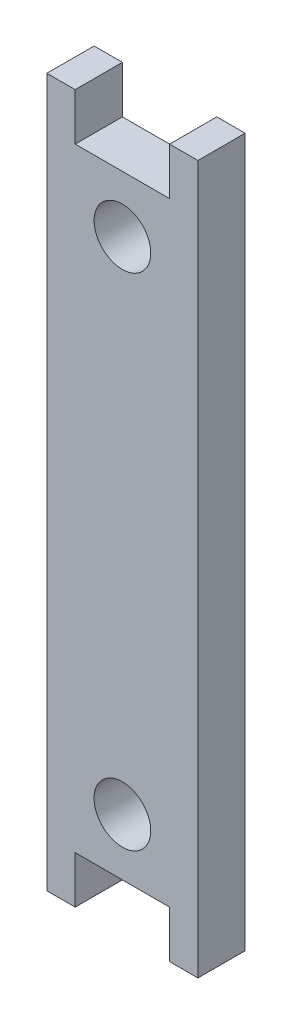
ISO-10303-21;
HEADER;
FILE_DESCRIPTION(('STEP AP214'),'2;1');
FILE_NAME('part.step','',(''),(''),'','','');
FILE_SCHEMA(('AUTOMOTIVE_DESIGN { 1 0 10303 214 1 1 1 1 }'));
ENDSEC;
DATA;
#1=APPLICATION_CONTEXT('core data for automotive mechanical design processes');
#2=APPLICATION_PROTOCOL_DEFINITION('international standard','automotive_design',2000,#1);
#3=PRODUCT_CONTEXT('',#1,'mechanical');
#4=PRODUCT('Part','Part','',(#3));
#5=PRODUCT_RELATED_PRODUCT_CATEGORY('part','',(#4));
#6=PRODUCT_DEFINITION_FORMATION('','',#4);
#7=PRODUCT_DEFINITION_CONTEXT('part definition',#1,'design');
#8=PRODUCT_DEFINITION('design','',#6,#7);
#9=PRODUCT_DEFINITION_SHAPE('','',#8);
#10=(LENGTH_UNIT() NAMED_UNIT(*) SI_UNIT(.MILLI.,.METRE.));
#11=(NAMED_UNIT(*) PLANE_ANGLE_UNIT() SI_UNIT($,.RADIAN.));
#12=(NAMED_UNIT(*) SI_UNIT($,.STERADIAN.) SOLID_ANGLE_UNIT());
#13=UNCERTAINTY_MEASURE_WITH_UNIT(LENGTH_MEASURE(1.E-05),#10,'distance_accuracy_value','');
#14=(GEOMETRIC_REPRESENTATION_CONTEXT(3) GLOBAL_UNCERTAINTY_ASSIGNED_CONTEXT((#13)) GLOBAL_UNIT_ASSIGNED_CONTEXT((#10,
#11,#12)) REPRESENTATION_CONTEXT('',''));
#15=CARTESIAN_POINT('',(0.,0.,0.));
#16=DIRECTION('',(0.,0.,1.));
#17=DIRECTION('',(1.,0.,0.));
#18=AXIS2_PLACEMENT_3D('',#15,#16,#17);
#19=CARTESIAN_POINT('',(0.,0.,5.));
#20=DIRECTION('',(0.,0.,1.));
#21=DIRECTION('',(1.,0.,0.));
#22=AXIS2_PLACEMENT_3D('',#19,#20,#21);
#23=PLANE('',#22);
#24=CARTESIAN_POINT('',(0.,26.5,5.));
#25=DIRECTION('',(0.,0.,1.));
#26=DIRECTION('',(1.,0.,0.));
#27=AXIS2_PLACEMENT_3D('',#24,#25,#26);
#28=CIRCLE('',#27,3.);
#29=CARTESIAN_POINT('',(3.,26.5,5.));
#30=VERTEX_POINT('',#29);
#31=EDGE_CURVE('E164',#30,#30,#28,.T.);
#32=ORIENTED_EDGE('',*,*,#31,.F.);
#33=EDGE_LOOP('',(#32));
#34=FACE_BOUND('',#33,.T.);
#35=DIRECTION('',(0.,1.,0.));
#36=VECTOR('',#35,1.);
#37=CARTESIAN_POINT('',(-5.,37.5000000000001,5.));
#38=LINE('',#37,#36);
#39=CARTESIAN_POINT('',(-5.,32.5000000000001,5.));
#40=VERTEX_POINT('',#39);
#41=CARTESIAN_POINT('',(-5.,37.5000000000001,5.));
#42=VERTEX_POINT('',#41);
#43=EDGE_CURVE('E183',#40,#42,#38,.T.);
#44=ORIENTED_EDGE('',*,*,#43,.T.);
#45=DIRECTION('',(-1.,0.,0.));
#46=VECTOR('',#45,1.);
#47=CARTESIAN_POINT('',(-5.,37.5000000000001,5.));
#48=LINE('',#47,#46);
#49=CARTESIAN_POINT('',(-7.99999999999998,37.5,5.));
#50=VERTEX_POINT('',#49);
#51=EDGE_CURVE('E111',#42,#50,#48,.T.);
#52=ORIENTED_EDGE('',*,*,#51,.T.);
#53=DIRECTION('',(0.,-1.,0.));
#54=VECTOR('',#53,1.);
#55=CARTESIAN_POINT('',(-7.99999999999998,37.5,5.));
#56=LINE('',#55,#54);
#57=CARTESIAN_POINT('',(-7.99999999999998,-37.5,5.));
#58=VERTEX_POINT('',#57);
#59=EDGE_CURVE('E210',#50,#58,#56,.T.);
#60=ORIENTED_EDGE('',*,*,#59,.T.);
#61=DIRECTION('',(1.,0.,0.));
#62=VECTOR('',#61,1.);
#63=CARTESIAN_POINT('',(-7.99999999999998,-37.5,5.));
#64=LINE('',#63,#62);
#65=CARTESIAN_POINT('',(-5.,-37.5000000000001,5.));
#66=VERTEX_POINT('',#65);
#67=EDGE_CURVE('E229',#58,#66,#64,.T.);
#68=ORIENTED_EDGE('',*,*,#67,.T.);
#69=DIRECTION('',(0.,1.,0.));
#70=VECTOR('',#69,1.);
#71=CARTESIAN_POINT('',(-5.,-37.5000000000001,5.));
#72=LINE('',#71,#70);
#73=CARTESIAN_POINT('',(-5.,-32.5000000000001,5.));
#74=VERTEX_POINT('',#73);
#75=EDGE_CURVE('E226',#66,#74,#72,.T.);
#76=ORIENTED_EDGE('',*,*,#75,.T.);
#77=DIRECTION('',(1.,0.,0.));
#78=VECTOR('',#77,1.);
#79=CARTESIAN_POINT('',(-5.,-32.5000000000001,5.));
#80=LINE('',#79,#78);
#81=CARTESIAN_POINT('',(5.,-32.5000000000001,5.));
#82=VERTEX_POINT('',#81);
#83=EDGE_CURVE('E228',#74,#82,#80,.T.);
#84=ORIENTED_EDGE('',*,*,#83,.T.);
#85=DIRECTION('',(0.,-1.,0.));
#86=VECTOR('',#85,1.);
#87=CARTESIAN_POINT('',(5.,-32.5000000000001,5.));
#88=LINE('',#87,#86);
#89=CARTESIAN_POINT('',(5.,-37.5000000000001,5.));
#90=VERTEX_POINT('',#89);
#91=EDGE_CURVE('E231',#82,#90,#88,.T.);
#92=ORIENTED_EDGE('',*,*,#91,.T.);
#93=DIRECTION('',(1.,0.,0.));
#94=VECTOR('',#93,1.);
#95=CARTESIAN_POINT('',(5.,-37.5000000000001,5.));
#96=LINE('',#95,#94);
#97=CARTESIAN_POINT('',(8.,-37.5,5.));
#98=VERTEX_POINT('',#97);
#99=EDGE_CURVE('E237',#90,#98,#96,.T.);
#100=ORIENTED_EDGE('',*,*,#99,.T.);
#101=DIRECTION('',(0.,1.,0.));
#102=VECTOR('',#101,1.);
#103=CARTESIAN_POINT('',(8.,-37.5,5.));
#104=LINE('',#103,#102);
#105=CARTESIAN_POINT('',(8.00000000000002,37.5,5.));
#106=VERTEX_POINT('',#105);
#107=EDGE_CURVE('E142',#98,#106,#104,.T.);
#108=ORIENTED_EDGE('',*,*,#107,.T.);
#109=DIRECTION('',(-1.,0.,0.));
#110=VECTOR('',#109,1.);
#111=CARTESIAN_POINT('',(8.00000000000002,37.5,5.));
#112=LINE('',#111,#110);
#113=CARTESIAN_POINT('',(5.,37.5000000000001,5.));
#114=VERTEX_POINT('',#113);
#115=EDGE_CURVE('E136',#106,#114,#112,.T.);
#116=ORIENTED_EDGE('',*,*,#115,.T.);
#117=DIRECTION('',(0.,-1.,0.));
#118=VECTOR('',#117,1.);
#119=CARTESIAN_POINT('',(5.,32.5000000000001,5.));
#120=LINE('',#119,#118);
#121=CARTESIAN_POINT('',(5.,32.5000000000001,5.));
#122=VERTEX_POINT('',#121);
#123=EDGE_CURVE('E140',#114,#122,#120,.T.);
#124=ORIENTED_EDGE('',*,*,#123,.T.);
#125=DIRECTION('',(-1.,0.,0.));
#126=VECTOR('',#125,1.);
#127=CARTESIAN_POINT('',(-5.,32.5000000000001,5.));
#128=LINE('',#127,#126);
#129=EDGE_CURVE('E56',#122,#40,#128,.T.);
#130=ORIENTED_EDGE('',*,*,#129,.T.);
#131=EDGE_LOOP('',(#44,#52,#60,#68,#76,#84,#92,#100,#108,#116,#124,#130));
#132=FACE_BOUND('',#131,.T.);
#133=CARTESIAN_POINT('',(0.,-26.5,5.));
#134=DIRECTION('',(0.,0.,1.));
#135=DIRECTION('',(-1.,0.,0.));
#136=AXIS2_PLACEMENT_3D('',#133,#134,#135);
#137=CIRCLE('',#136,3.);
#138=CARTESIAN_POINT('',(-3.,-26.5,5.));
#139=VERTEX_POINT('',#138);
#140=EDGE_CURVE('E279',#139,#139,#137,.T.);
#141=ORIENTED_EDGE('',*,*,#140,.F.);
#142=EDGE_LOOP('',(#141));
#143=FACE_BOUND('',#142,.T.);
#144=ADVANCED_FACE('F39',(#34,#132,#143),#23,.T.);
#145=CARTESIAN_POINT('',(0.,0.,0.));
#146=DIRECTION('',(0.,0.,1.));
#147=DIRECTION('',(1.,0.,0.));
#148=AXIS2_PLACEMENT_3D('',#145,#146,#147);
#149=PLANE('',#148);
#150=DIRECTION('',(0.,1.,0.));
#151=VECTOR('',#150,1.);
#152=CARTESIAN_POINT('',(-5.,37.5000000000001,0.));
#153=LINE('',#152,#151);
#154=CARTESIAN_POINT('',(-5.,32.5000000000001,0.));
#155=VERTEX_POINT('',#154);
#156=CARTESIAN_POINT('',(-5.,37.5000000000001,0.));
#157=VERTEX_POINT('',#156);
#158=EDGE_CURVE('E160',#155,#157,#153,.T.);
#159=ORIENTED_EDGE('',*,*,#158,.F.);
#160=DIRECTION('',(-1.,0.,0.));
#161=VECTOR('',#160,1.);
#162=CARTESIAN_POINT('',(-5.,32.5000000000001,0.));
#163=LINE('',#162,#161);
#164=CARTESIAN_POINT('',(5.,32.5000000000001,0.));
#165=VERTEX_POINT('',#164);
#166=EDGE_CURVE('E103',#165,#155,#163,.T.);
#167=ORIENTED_EDGE('',*,*,#166,.F.);
#168=DIRECTION('',(0.,-1.,0.));
#169=VECTOR('',#168,1.);
#170=CARTESIAN_POINT('',(5.,32.5000000000001,0.));
#171=LINE('',#170,#169);
#172=CARTESIAN_POINT('',(5.,37.5000000000001,0.));
#173=VERTEX_POINT('',#172);
#174=EDGE_CURVE('E97',#173,#165,#171,.T.);
#175=ORIENTED_EDGE('',*,*,#174,.F.);
#176=DIRECTION('',(-1.,0.,0.));
#177=VECTOR('',#176,1.);
#178=CARTESIAN_POINT('',(8.00000000000002,37.5,0.));
#179=LINE('',#178,#177);
#180=CARTESIAN_POINT('',(8.00000000000002,37.5,0.));
#181=VERTEX_POINT('',#180);
#182=EDGE_CURVE('E150',#181,#173,#179,.T.);
#183=ORIENTED_EDGE('',*,*,#182,.F.);
#184=DIRECTION('',(0.,1.,0.));
#185=VECTOR('',#184,1.);
#186=CARTESIAN_POINT('',(8.,-37.5,0.));
#187=LINE('',#186,#185);
#188=CARTESIAN_POINT('',(8.,-37.5,0.));
#189=VERTEX_POINT('',#188);
#190=EDGE_CURVE('E178',#189,#181,#187,.T.);
#191=ORIENTED_EDGE('',*,*,#190,.F.);
#192=DIRECTION('',(1.,0.,0.));
#193=VECTOR('',#192,1.);
#194=CARTESIAN_POINT('',(5.,-37.5000000000001,0.));
#195=LINE('',#194,#193);
#196=CARTESIAN_POINT('',(5.,-37.5000000000001,0.));
#197=VERTEX_POINT('',#196);
#198=EDGE_CURVE('E176',#197,#189,#195,.T.);
#199=ORIENTED_EDGE('',*,*,#198,.F.);
#200=DIRECTION('',(0.,-1.,0.));
#201=VECTOR('',#200,1.);
#202=CARTESIAN_POINT('',(5.,-32.5000000000001,0.));
#203=LINE('',#202,#201);
#204=CARTESIAN_POINT('',(5.,-32.5000000000001,0.));
#205=VERTEX_POINT('',#204);
#206=EDGE_CURVE('E174',#205,#197,#203,.T.);
#207=ORIENTED_EDGE('',*,*,#206,.F.);
#208=DIRECTION('',(1.,0.,0.));
#209=VECTOR('',#208,1.);
#210=CARTESIAN_POINT('',(-5.,-32.5000000000001,0.));
#211=LINE('',#210,#209);
#212=CARTESIAN_POINT('',(-5.,-32.5000000000001,0.));
#213=VERTEX_POINT('',#212);
#214=EDGE_CURVE('E172',#213,#205,#211,.T.);
#215=ORIENTED_EDGE('',*,*,#214,.F.);
#216=DIRECTION('',(0.,1.,0.));
#217=VECTOR('',#216,1.);
#218=CARTESIAN_POINT('',(-5.,-37.5000000000001,0.));
#219=LINE('',#218,#217);
#220=CARTESIAN_POINT('',(-5.,-37.5000000000001,0.));
#221=VERTEX_POINT('',#220);
#222=EDGE_CURVE('E170',#221,#213,#219,.T.);
#223=ORIENTED_EDGE('',*,*,#222,.F.);
#224=DIRECTION('',(1.,0.,0.));
#225=VECTOR('',#224,1.);
#226=CARTESIAN_POINT('',(-7.99999999999998,-37.5,0.));
#227=LINE('',#226,#225);
#228=CARTESIAN_POINT('',(-7.99999999999998,-37.5,0.));
#229=VERTEX_POINT('',#228);
#230=EDGE_CURVE('E168',#229,#221,#227,.T.);
#231=ORIENTED_EDGE('',*,*,#230,.F.);
#232=DIRECTION('',(0.,-1.,0.));
#233=VECTOR('',#232,1.);
#234=CARTESIAN_POINT('',(-7.99999999999998,37.5,0.));
#235=LINE('',#234,#233);
#236=CARTESIAN_POINT('',(-7.99999999999998,37.5,0.));
#237=VERTEX_POINT('',#236);
#238=EDGE_CURVE('E166',#237,#229,#235,.T.);
#239=ORIENTED_EDGE('',*,*,#238,.F.);
#240=DIRECTION('',(-1.,0.,0.));
#241=VECTOR('',#240,1.);
#242=CARTESIAN_POINT('',(-5.,37.5000000000001,0.));
#243=LINE('',#242,#241);
#244=EDGE_CURVE('E163',#157,#237,#243,.T.);
#245=ORIENTED_EDGE('',*,*,#244,.F.);
#246=EDGE_LOOP('',(#159,#167,#175,#183,#191,#199,#207,#215,#223,#231,#239,#245));
#247=FACE_BOUND('',#246,.T.);
#248=CARTESIAN_POINT('',(0.,26.5,0.));
#249=DIRECTION('',(0.,0.,1.));
#250=DIRECTION('',(1.,0.,0.));
#251=AXIS2_PLACEMENT_3D('',#248,#249,#250);
#252=CIRCLE('',#251,3.);
#253=CARTESIAN_POINT('',(3.,26.5,0.));
#254=VERTEX_POINT('',#253);
#255=EDGE_CURVE('E285',#254,#254,#252,.T.);
#256=ORIENTED_EDGE('',*,*,#255,.T.);
#257=EDGE_LOOP('',(#256));
#258=FACE_BOUND('',#257,.T.);
#259=CARTESIAN_POINT('',(0.,-26.5,0.));
#260=DIRECTION('',(0.,0.,1.));
#261=DIRECTION('',(-1.,0.,0.));
#262=AXIS2_PLACEMENT_3D('',#259,#260,#261);
#263=CIRCLE('',#262,3.);
#264=CARTESIAN_POINT('',(-3.,-26.5,0.));
#265=VERTEX_POINT('',#264);
#266=EDGE_CURVE('E282',#265,#265,#263,.T.);
#267=ORIENTED_EDGE('',*,*,#266,.T.);
#268=EDGE_LOOP('',(#267));
#269=FACE_BOUND('',#268,.T.);
#270=ADVANCED_FACE('F214',(#247,#258,#269),#149,.F.);
#271=CARTESIAN_POINT('',(-5.,37.5000000000001,5.));
#272=DIRECTION('',(-1.,0.,0.));
#273=DIRECTION('',(0.,-1.,0.));
#274=AXIS2_PLACEMENT_3D('',#271,#272,#273);
#275=PLANE('',#274);
#276=ORIENTED_EDGE('',*,*,#158,.T.);
#277=DIRECTION('',(0.,0.,-1.));
#278=VECTOR('',#277,1.);
#279=CARTESIAN_POINT('',(-5.,37.5000000000001,5.));
#280=LINE('',#279,#278);
#281=EDGE_CURVE('E11',#42,#157,#280,.T.);
#282=ORIENTED_EDGE('',*,*,#281,.F.);
#283=ORIENTED_EDGE('',*,*,#43,.F.);
#284=DIRECTION('',(0.,0.,-1.));
#285=VECTOR('',#284,1.);
#286=CARTESIAN_POINT('',(-5.,32.5000000000001,5.));
#287=LINE('',#286,#285);
#288=EDGE_CURVE('E156',#40,#155,#287,.T.);
#289=ORIENTED_EDGE('',*,*,#288,.T.);
#290=EDGE_LOOP('',(#276,#282,#283,#289));
#291=FACE_BOUND('',#290,.T.);
#292=ADVANCED_FACE('F41',(#291),#275,.F.);
#293=CARTESIAN_POINT('',(-5.,37.5000000000001,5.));
#294=DIRECTION('',(0.,-1.,0.));
#295=DIRECTION('',(1.,0.,0.));
#296=AXIS2_PLACEMENT_3D('',#293,#294,#295);
#297=PLANE('',#296);
#298=ORIENTED_EDGE('',*,*,#244,.T.);
#299=DIRECTION('',(0.,0.,-1.));
#300=VECTOR('',#299,1.);
#301=CARTESIAN_POINT('',(-7.99999999999998,37.5,5.));
#302=LINE('',#301,#300);
#303=EDGE_CURVE('E48',#50,#237,#302,.T.);
#304=ORIENTED_EDGE('',*,*,#303,.F.);
#305=ORIENTED_EDGE('',*,*,#51,.F.);
#306=ORIENTED_EDGE('',*,*,#281,.T.);
#307=EDGE_LOOP('',(#298,#304,#305,#306));
#308=FACE_BOUND('',#307,.T.);
#309=ADVANCED_FACE('F380',(#308),#297,.F.);
#310=CARTESIAN_POINT('',(-7.99999999999998,37.5,5.));
#311=DIRECTION('',(1.,0.,0.));
#312=DIRECTION('',(0.,0.,-1.));
#313=AXIS2_PLACEMENT_3D('',#310,#311,#312);
#314=PLANE('',#313);
#315=ORIENTED_EDGE('',*,*,#238,.T.);
#316=DIRECTION('',(0.,0.,-1.));
#317=VECTOR('',#316,1.);
#318=CARTESIAN_POINT('',(-7.99999999999998,-37.5,5.));
#319=LINE('',#318,#317);
#320=EDGE_CURVE('E202',#58,#229,#319,.T.);
#321=ORIENTED_EDGE('',*,*,#320,.F.);
#322=ORIENTED_EDGE('',*,*,#59,.F.);
#323=ORIENTED_EDGE('',*,*,#303,.T.);
#324=EDGE_LOOP('',(#315,#321,#322,#323));
#325=FACE_BOUND('',#324,.T.);
#326=ADVANCED_FACE('F208',(#325),#314,.F.);
#327=CARTESIAN_POINT('',(-7.99999999999998,-37.5,5.));
#328=DIRECTION('',(0.,1.,0.));
#329=DIRECTION('',(-1.,0.,0.));
#330=AXIS2_PLACEMENT_3D('',#327,#328,#329);
#331=PLANE('',#330);
#332=ORIENTED_EDGE('',*,*,#230,.T.);
#333=DIRECTION('',(0.,0.,-1.));
#334=VECTOR('',#333,1.);
#335=CARTESIAN_POINT('',(-5.,-37.5000000000001,5.));
#336=LINE('',#335,#334);
#337=EDGE_CURVE('E199',#66,#221,#336,.T.);
#338=ORIENTED_EDGE('',*,*,#337,.F.);
#339=ORIENTED_EDGE('',*,*,#67,.F.);
#340=ORIENTED_EDGE('',*,*,#320,.T.);
#341=EDGE_LOOP('',(#332,#338,#339,#340));
#342=FACE_BOUND('',#341,.T.);
#343=ADVANCED_FACE('F220',(#342),#331,.F.);
#344=CARTESIAN_POINT('',(-5.,-37.5000000000001,5.));
#345=DIRECTION('',(-1.,0.,0.));
#346=DIRECTION('',(0.,-1.,0.));
#347=AXIS2_PLACEMENT_3D('',#344,#345,#346);
#348=PLANE('',#347);
#349=ORIENTED_EDGE('',*,*,#222,.T.);
#350=DIRECTION('',(0.,0.,-1.));
#351=VECTOR('',#350,1.);
#352=CARTESIAN_POINT('',(-5.,-32.5000000000001,5.));
#353=LINE('',#352,#351);
#354=EDGE_CURVE('E196',#74,#213,#353,.T.);
#355=ORIENTED_EDGE('',*,*,#354,.F.);
#356=ORIENTED_EDGE('',*,*,#75,.F.);
#357=ORIENTED_EDGE('',*,*,#337,.T.);
#358=EDGE_LOOP('',(#349,#355,#356,#357));
#359=FACE_BOUND('',#358,.T.);
#360=ADVANCED_FACE('F224',(#359),#348,.F.);
#361=CARTESIAN_POINT('',(-5.,-32.5000000000001,5.));
#362=DIRECTION('',(0.,1.,0.));
#363=DIRECTION('',(0.,0.,1.));
#364=AXIS2_PLACEMENT_3D('',#361,#362,#363);
#365=PLANE('',#364);
#366=ORIENTED_EDGE('',*,*,#214,.T.);
#367=DIRECTION('',(0.,0.,-1.));
#368=VECTOR('',#367,1.);
#369=CARTESIAN_POINT('',(5.,-32.5000000000001,5.));
#370=LINE('',#369,#368);
#371=EDGE_CURVE('E193',#82,#205,#370,.T.);
#372=ORIENTED_EDGE('',*,*,#371,.F.);
#373=ORIENTED_EDGE('',*,*,#83,.F.);
#374=ORIENTED_EDGE('',*,*,#354,.T.);
#375=EDGE_LOOP('',(#366,#372,#373,#374));
#376=FACE_BOUND('',#375,.T.);
#377=ADVANCED_FACE('F345',(#376),#365,.F.);
#378=CARTESIAN_POINT('',(5.,-32.5000000000001,5.));
#379=DIRECTION('',(1.,0.,0.));
#380=DIRECTION('',(0.,1.,0.));
#381=AXIS2_PLACEMENT_3D('',#378,#379,#380);
#382=PLANE('',#381);
#383=ORIENTED_EDGE('',*,*,#206,.T.);
#384=DIRECTION('',(0.,0.,-1.));
#385=VECTOR('',#384,1.);
#386=CARTESIAN_POINT('',(5.,-37.5000000000001,5.));
#387=LINE('',#386,#385);
#388=EDGE_CURVE('E190',#90,#197,#387,.T.);
#389=ORIENTED_EDGE('',*,*,#388,.F.);
#390=ORIENTED_EDGE('',*,*,#91,.F.);
#391=ORIENTED_EDGE('',*,*,#371,.T.);
#392=EDGE_LOOP('',(#383,#389,#390,#391));
#393=FACE_BOUND('',#392,.T.);
#394=ADVANCED_FACE('F336',(#393),#382,.F.);
#395=CARTESIAN_POINT('',(5.,-37.5000000000001,5.));
#396=DIRECTION('',(0.,1.,0.));
#397=DIRECTION('',(-1.,0.,0.));
#398=AXIS2_PLACEMENT_3D('',#395,#396,#397);
#399=PLANE('',#398);
#400=ORIENTED_EDGE('',*,*,#198,.T.);
#401=DIRECTION('',(0.,0.,-1.));
#402=VECTOR('',#401,1.);
#403=CARTESIAN_POINT('',(8.,-37.5,5.));
#404=LINE('',#403,#402);
#405=EDGE_CURVE('E187',#98,#189,#404,.T.);
#406=ORIENTED_EDGE('',*,*,#405,.F.);
#407=ORIENTED_EDGE('',*,*,#99,.F.);
#408=ORIENTED_EDGE('',*,*,#388,.T.);
#409=EDGE_LOOP('',(#400,#406,#407,#408));
#410=FACE_BOUND('',#409,.T.);
#411=ADVANCED_FACE('F243',(#410),#399,.F.);
#412=CARTESIAN_POINT('',(8.,-37.5,5.));
#413=DIRECTION('',(-1.,0.,0.));
#414=DIRECTION('',(0.,-1.,0.));
#415=AXIS2_PLACEMENT_3D('',#412,#413,#414);
#416=PLANE('',#415);
#417=ORIENTED_EDGE('',*,*,#190,.T.);
#418=DIRECTION('',(0.,0.,-1.));
#419=VECTOR('',#418,1.);
#420=CARTESIAN_POINT('',(8.00000000000002,37.5,5.));
#421=LINE('',#420,#419);
#422=EDGE_CURVE('E151',#106,#181,#421,.T.);
#423=ORIENTED_EDGE('',*,*,#422,.F.);
#424=ORIENTED_EDGE('',*,*,#107,.F.);
#425=ORIENTED_EDGE('',*,*,#405,.T.);
#426=EDGE_LOOP('',(#417,#423,#424,#425));
#427=FACE_BOUND('',#426,.T.);
#428=ADVANCED_FACE('F247',(#427),#416,.F.);
#429=CARTESIAN_POINT('',(8.00000000000002,37.5,5.));
#430=DIRECTION('',(0.,-1.,0.));
#431=DIRECTION('',(1.,0.,0.));
#432=AXIS2_PLACEMENT_3D('',#429,#430,#431);
#433=PLANE('',#432);
#434=ORIENTED_EDGE('',*,*,#182,.T.);
#435=DIRECTION('',(0.,0.,-1.));
#436=VECTOR('',#435,1.);
#437=CARTESIAN_POINT('',(5.,37.5000000000001,5.));
#438=LINE('',#437,#436);
#439=EDGE_CURVE('E147',#114,#173,#438,.T.);
#440=ORIENTED_EDGE('',*,*,#439,.F.);
#441=ORIENTED_EDGE('',*,*,#115,.F.);
#442=ORIENTED_EDGE('',*,*,#422,.T.);
#443=EDGE_LOOP('',(#434,#440,#441,#442));
#444=FACE_BOUND('',#443,.T.);
#445=ADVANCED_FACE('F148',(#444),#433,.F.);
#446=CARTESIAN_POINT('',(5.,32.5000000000001,5.));
#447=DIRECTION('',(1.,0.,0.));
#448=DIRECTION('',(0.,1.,0.));
#449=AXIS2_PLACEMENT_3D('',#446,#447,#448);
#450=PLANE('',#449);
#451=ORIENTED_EDGE('',*,*,#174,.T.);
#452=DIRECTION('',(0.,0.,-1.));
#453=VECTOR('',#452,1.);
#454=CARTESIAN_POINT('',(5.,32.5000000000001,5.));
#455=LINE('',#454,#453);
#456=EDGE_CURVE('E152',#122,#165,#455,.T.);
#457=ORIENTED_EDGE('',*,*,#456,.F.);
#458=ORIENTED_EDGE('',*,*,#123,.F.);
#459=ORIENTED_EDGE('',*,*,#439,.T.);
#460=EDGE_LOOP('',(#451,#457,#458,#459));
#461=FACE_BOUND('',#460,.T.);
#462=ADVANCED_FACE('F154',(#461),#450,.F.);
#463=CARTESIAN_POINT('',(-5.,32.5000000000001,5.));
#464=DIRECTION('',(0.,-1.,0.));
#465=DIRECTION('',(0.,0.,-1.));
#466=AXIS2_PLACEMENT_3D('',#463,#464,#465);
#467=PLANE('',#466);
#468=ORIENTED_EDGE('',*,*,#166,.T.);
#469=ORIENTED_EDGE('',*,*,#288,.F.);
#470=ORIENTED_EDGE('',*,*,#129,.F.);
#471=ORIENTED_EDGE('',*,*,#456,.T.);
#472=EDGE_LOOP('',(#468,#469,#470,#471));
#473=FACE_BOUND('',#472,.T.);
#474=ADVANCED_FACE('F251',(#473),#467,.F.);
#475=CARTESIAN_POINT('',(0.,26.5,5.));
#476=DIRECTION('',(0.,0.,-1.));
#477=DIRECTION('',(-1.,0.,0.));
#478=AXIS2_PLACEMENT_3D('',#475,#476,#477);
#479=CYLINDRICAL_SURFACE('',#478,3.);
#480=ORIENTED_EDGE('',*,*,#31,.T.);
#481=EDGE_LOOP('',(#480));
#482=FACE_BOUND('',#481,.T.);
#483=ORIENTED_EDGE('',*,*,#255,.F.);
#484=EDGE_LOOP('',(#483));
#485=FACE_BOUND('',#484,.T.);
#486=ADVANCED_FACE('F253',(#482,#485),#479,.F.);
#487=CARTESIAN_POINT('',(0.,-26.5,5.));
#488=DIRECTION('',(0.,0.,-1.));
#489=DIRECTION('',(-1.,0.,0.));
#490=AXIS2_PLACEMENT_3D('',#487,#488,#489);
#491=CYLINDRICAL_SURFACE('',#490,3.);
#492=ORIENTED_EDGE('',*,*,#140,.T.);
#493=EDGE_LOOP('',(#492));
#494=FACE_BOUND('',#493,.T.);
#495=ORIENTED_EDGE('',*,*,#266,.F.);
#496=EDGE_LOOP('',(#495));
#497=FACE_BOUND('',#496,.T.);
#498=ADVANCED_FACE('F259',(#494,#497),#491,.F.);
#499=CLOSED_SHELL('',(#144,#270,#292,#309,#326,#343,#360,#377,#394,#411,#428,#445,#462,#474,
#486,#498));
#500=MANIFOLD_SOLID_BREP('B2',#499);
#501=ADVANCED_BREP_SHAPE_REPRESENTATION('',(#18,#500),#14);
#502=SHAPE_DEFINITION_REPRESENTATION(#9,#501);
ENDSEC;
END-ISO-10303-21;
